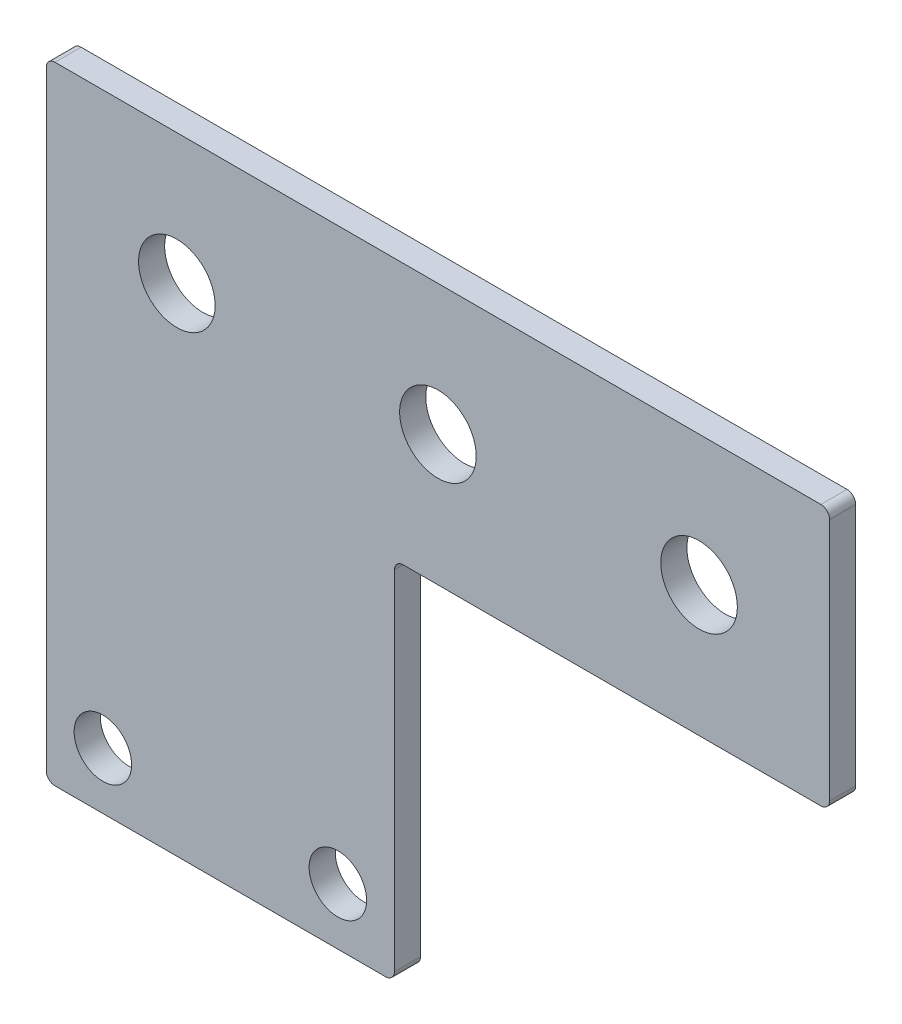
ISO-10303-21;
HEADER;
FILE_DESCRIPTION(('STEP AP214'),'2;1');
FILE_NAME('part.step','',(''),(''),'','','');
FILE_SCHEMA(('AUTOMOTIVE_DESIGN { 1 0 10303 214 1 1 1 1 }'));
ENDSEC;
DATA;
#1=APPLICATION_CONTEXT('core data for automotive mechanical design processes');
#2=APPLICATION_PROTOCOL_DEFINITION('international standard','automotive_design',2000,#1);
#3=PRODUCT_CONTEXT('',#1,'mechanical');
#4=PRODUCT('Part','Part','',(#3));
#5=PRODUCT_RELATED_PRODUCT_CATEGORY('part','',(#4));
#6=PRODUCT_DEFINITION_FORMATION('','',#4);
#7=PRODUCT_DEFINITION_CONTEXT('part definition',#1,'design');
#8=PRODUCT_DEFINITION('design','',#6,#7);
#9=PRODUCT_DEFINITION_SHAPE('','',#8);
#10=(LENGTH_UNIT() NAMED_UNIT(*) SI_UNIT(.MILLI.,.METRE.));
#11=(NAMED_UNIT(*) PLANE_ANGLE_UNIT() SI_UNIT($,.RADIAN.));
#12=(NAMED_UNIT(*) SI_UNIT($,.STERADIAN.) SOLID_ANGLE_UNIT());
#13=UNCERTAINTY_MEASURE_WITH_UNIT(LENGTH_MEASURE(1.E-05),#10,'distance_accuracy_value','');
#14=(GEOMETRIC_REPRESENTATION_CONTEXT(3) GLOBAL_UNCERTAINTY_ASSIGNED_CONTEXT((#13)) GLOBAL_UNIT_ASSIGNED_CONTEXT((#10,
#11,#12)) REPRESENTATION_CONTEXT('',''));
#15=CARTESIAN_POINT('',(0.,0.,0.));
#16=DIRECTION('',(0.,0.,1.));
#17=DIRECTION('',(1.,0.,0.));
#18=AXIS2_PLACEMENT_3D('',#15,#16,#17);
#19=CARTESIAN_POINT('',(0.,0.,3.));
#20=DIRECTION('',(0.,-1.,0.));
#21=DIRECTION('',(1.,0.,0.));
#22=AXIS2_PLACEMENT_3D('',#19,#20,#21);
#23=PLANE('',#22);
#24=DIRECTION('',(-1.,0.,0.));
#25=VECTOR('',#24,1.);
#26=CARTESIAN_POINT('',(0.,0.,0.));
#27=LINE('',#26,#25);
#28=CARTESIAN_POINT('',(89.,0.,0.));
#29=VERTEX_POINT('',#28);
#30=CARTESIAN_POINT('',(1.,0.,0.));
#31=VERTEX_POINT('',#30);
#32=EDGE_CURVE('E390',#29,#31,#27,.T.);
#33=ORIENTED_EDGE('',*,*,#32,.T.);
#34=DIRECTION('',(0.,0.,-1.));
#35=VECTOR('',#34,1.);
#36=CARTESIAN_POINT('',(1.,0.,3.));
#37=LINE('',#36,#35);
#38=CARTESIAN_POINT('',(1.,0.,3.));
#39=VERTEX_POINT('',#38);
#40=EDGE_CURVE('E247',#31,#39,#37,.F.);
#41=ORIENTED_EDGE('',*,*,#40,.T.);
#42=DIRECTION('',(-1.,0.,0.));
#43=VECTOR('',#42,1.);
#44=CARTESIAN_POINT('',(0.,0.,3.));
#45=LINE('',#44,#43);
#46=CARTESIAN_POINT('',(89.,0.,3.));
#47=VERTEX_POINT('',#46);
#48=EDGE_CURVE('E203',#47,#39,#45,.T.);
#49=ORIENTED_EDGE('',*,*,#48,.F.);
#50=DIRECTION('',(0.,0.,-1.));
#51=VECTOR('',#50,1.);
#52=CARTESIAN_POINT('',(89.,0.,3.));
#53=LINE('',#52,#51);
#54=EDGE_CURVE('E243',#47,#29,#53,.T.);
#55=ORIENTED_EDGE('',*,*,#54,.T.);
#56=EDGE_LOOP('',(#33,#41,#49,#55));
#57=FACE_BOUND('',#56,.T.);
#58=ADVANCED_FACE('F46',(#57),#23,.F.);
#59=CARTESIAN_POINT('',(0.,0.,3.));
#60=DIRECTION('',(1.,0.,0.));
#61=DIRECTION('',(0.,1.,0.));
#62=AXIS2_PLACEMENT_3D('',#59,#60,#61);
#63=PLANE('',#62);
#64=DIRECTION('',(0.,-1.,0.));
#65=VECTOR('',#64,1.);
#66=CARTESIAN_POINT('',(0.,0.,0.));
#67=LINE('',#66,#65);
#68=CARTESIAN_POINT('',(0.,-1.,0.));
#69=VERTEX_POINT('',#68);
#70=CARTESIAN_POINT('',(0.,-71.,0.));
#71=VERTEX_POINT('',#70);
#72=EDGE_CURVE('E177',#69,#71,#67,.T.);
#73=ORIENTED_EDGE('',*,*,#72,.T.);
#74=DIRECTION('',(0.,0.,-1.));
#75=VECTOR('',#74,1.);
#76=CARTESIAN_POINT('',(0.,-71.,3.));
#77=LINE('',#76,#75);
#78=CARTESIAN_POINT('',(0.,-71.,3.));
#79=VERTEX_POINT('',#78);
#80=EDGE_CURVE('E240',#71,#79,#77,.F.);
#81=ORIENTED_EDGE('',*,*,#80,.T.);
#82=DIRECTION('',(0.,-1.,0.));
#83=VECTOR('',#82,1.);
#84=CARTESIAN_POINT('',(0.,0.,3.));
#85=LINE('',#84,#83);
#86=CARTESIAN_POINT('',(0.,-1.,3.));
#87=VERTEX_POINT('',#86);
#88=EDGE_CURVE('E371',#87,#79,#85,.T.);
#89=ORIENTED_EDGE('',*,*,#88,.F.);
#90=DIRECTION('',(0.,0.,-1.));
#91=VECTOR('',#90,1.);
#92=CARTESIAN_POINT('',(0.,-1.,3.));
#93=LINE('',#92,#91);
#94=EDGE_CURVE('E236',#87,#69,#93,.T.);
#95=ORIENTED_EDGE('',*,*,#94,.T.);
#96=EDGE_LOOP('',(#73,#81,#89,#95));
#97=FACE_BOUND('',#96,.T.);
#98=ADVANCED_FACE('F411',(#97),#63,.F.);
#99=CARTESIAN_POINT('',(0.,-72.,3.));
#100=DIRECTION('',(0.,1.,0.));
#101=DIRECTION('',(-1.,0.,0.));
#102=AXIS2_PLACEMENT_3D('',#99,#100,#101);
#103=PLANE('',#102);
#104=DIRECTION('',(1.,0.,0.));
#105=VECTOR('',#104,1.);
#106=CARTESIAN_POINT('',(0.,-72.,0.));
#107=LINE('',#106,#105);
#108=CARTESIAN_POINT('',(1.00000000000001,-72.,0.));
#109=VERTEX_POINT('',#108);
#110=CARTESIAN_POINT('',(39.,-72.,0.));
#111=VERTEX_POINT('',#110);
#112=EDGE_CURVE('E168',#109,#111,#107,.T.);
#113=ORIENTED_EDGE('',*,*,#112,.T.);
#114=DIRECTION('',(0.,0.,-1.));
#115=VECTOR('',#114,1.);
#116=CARTESIAN_POINT('',(39.,-72.,3.));
#117=LINE('',#116,#115);
#118=CARTESIAN_POINT('',(39.,-72.,3.));
#119=VERTEX_POINT('',#118);
#120=EDGE_CURVE('E142',#111,#119,#117,.F.);
#121=ORIENTED_EDGE('',*,*,#120,.T.);
#122=DIRECTION('',(1.,0.,0.));
#123=VECTOR('',#122,1.);
#124=CARTESIAN_POINT('',(0.,-72.,3.));
#125=LINE('',#124,#123);
#126=CARTESIAN_POINT('',(1.00000000000001,-72.,3.));
#127=VERTEX_POINT('',#126);
#128=EDGE_CURVE('E366',#127,#119,#125,.T.);
#129=ORIENTED_EDGE('',*,*,#128,.F.);
#130=DIRECTION('',(0.,0.,-1.));
#131=VECTOR('',#130,1.);
#132=CARTESIAN_POINT('',(1.00000000000001,-72.,3.));
#133=LINE('',#132,#131);
#134=EDGE_CURVE('E148',#127,#109,#133,.T.);
#135=ORIENTED_EDGE('',*,*,#134,.T.);
#136=EDGE_LOOP('',(#113,#121,#129,#135));
#137=FACE_BOUND('',#136,.T.);
#138=ADVANCED_FACE('F419',(#137),#103,.F.);
#139=CARTESIAN_POINT('',(40.,0.,3.));
#140=DIRECTION('',(-1.,0.,0.));
#141=DIRECTION('',(0.,-1.,0.));
#142=AXIS2_PLACEMENT_3D('',#139,#140,#141);
#143=PLANE('',#142);
#144=DIRECTION('',(0.,1.,0.));
#145=VECTOR('',#144,1.);
#146=CARTESIAN_POINT('',(40.,0.,3.));
#147=LINE('',#146,#145);
#148=CARTESIAN_POINT('',(40.,-71.,3.));
#149=VERTEX_POINT('',#148);
#150=CARTESIAN_POINT('',(40.,-31.,3.));
#151=VERTEX_POINT('',#150);
#152=EDGE_CURVE('E158',#149,#151,#147,.T.);
#153=ORIENTED_EDGE('',*,*,#152,.F.);
#154=DIRECTION('',(0.,0.,-1.));
#155=VECTOR('',#154,1.);
#156=CARTESIAN_POINT('',(40.,-71.,3.));
#157=LINE('',#156,#155);
#158=CARTESIAN_POINT('',(40.,-71.,0.));
#159=VERTEX_POINT('',#158);
#160=EDGE_CURVE('E141',#149,#159,#157,.T.);
#161=ORIENTED_EDGE('',*,*,#160,.T.);
#162=DIRECTION('',(0.,1.,0.));
#163=VECTOR('',#162,1.);
#164=CARTESIAN_POINT('',(40.,0.,0.));
#165=LINE('',#164,#163);
#166=CARTESIAN_POINT('',(40.,-31.,0.));
#167=VERTEX_POINT('',#166);
#168=EDGE_CURVE('E155',#159,#167,#165,.T.);
#169=ORIENTED_EDGE('',*,*,#168,.T.);
#170=DIRECTION('',(0.,0.,-1.));
#171=VECTOR('',#170,1.);
#172=CARTESIAN_POINT('',(40.,-31.,3.));
#173=LINE('',#172,#171);
#174=EDGE_CURVE('E161',#167,#151,#173,.F.);
#175=ORIENTED_EDGE('',*,*,#174,.T.);
#176=EDGE_LOOP('',(#153,#161,#169,#175));
#177=FACE_BOUND('',#176,.T.);
#178=ADVANCED_FACE('F154',(#177),#143,.F.);
#179=CARTESIAN_POINT('',(0.,-30.,3.));
#180=DIRECTION('',(0.,1.,0.));
#181=DIRECTION('',(0.,0.,1.));
#182=AXIS2_PLACEMENT_3D('',#179,#180,#181);
#183=PLANE('',#182);
#184=DIRECTION('',(1.,0.,0.));
#185=VECTOR('',#184,1.);
#186=CARTESIAN_POINT('',(0.,-30.,0.));
#187=LINE('',#186,#185);
#188=CARTESIAN_POINT('',(41.,-30.,0.));
#189=VERTEX_POINT('',#188);
#190=CARTESIAN_POINT('',(89.,-30.,0.));
#191=VERTEX_POINT('',#190);
#192=EDGE_CURVE('E167',#189,#191,#187,.T.);
#193=ORIENTED_EDGE('',*,*,#192,.T.);
#194=DIRECTION('',(0.,0.,-1.));
#195=VECTOR('',#194,1.);
#196=CARTESIAN_POINT('',(89.,-30.,3.));
#197=LINE('',#196,#195);
#198=CARTESIAN_POINT('',(89.,-30.,3.));
#199=VERTEX_POINT('',#198);
#200=EDGE_CURVE('E260',#191,#199,#197,.F.);
#201=ORIENTED_EDGE('',*,*,#200,.T.);
#202=DIRECTION('',(1.,0.,0.));
#203=VECTOR('',#202,1.);
#204=CARTESIAN_POINT('',(0.,-30.,3.));
#205=LINE('',#204,#203);
#206=CARTESIAN_POINT('',(41.,-30.,3.));
#207=VERTEX_POINT('',#206);
#208=EDGE_CURVE('E357',#207,#199,#205,.T.);
#209=ORIENTED_EDGE('',*,*,#208,.F.);
#210=DIRECTION('',(0.,0.,-1.));
#211=VECTOR('',#210,1.);
#212=CARTESIAN_POINT('',(41.,-30.,0.));
#213=LINE('',#212,#211);
#214=EDGE_CURVE('E256',#207,#189,#213,.T.);
#215=ORIENTED_EDGE('',*,*,#214,.T.);
#216=EDGE_LOOP('',(#193,#201,#209,#215));
#217=FACE_BOUND('',#216,.T.);
#218=ADVANCED_FACE('F426',(#217),#183,.F.);
#219=CARTESIAN_POINT('',(15.,-15.,3.));
#220=DIRECTION('',(0.,0.,-1.));
#221=DIRECTION('',(-1.,0.,0.));
#222=AXIS2_PLACEMENT_3D('',#219,#220,#221);
#223=CYLINDRICAL_SURFACE('',#222,4.4);
#224=CARTESIAN_POINT('',(15.,-15.,3.));
#225=DIRECTION('',(0.,0.,1.));
#226=DIRECTION('',(1.,0.,0.));
#227=AXIS2_PLACEMENT_3D('',#224,#225,#226);
#228=CIRCLE('',#227,4.4);
#229=CARTESIAN_POINT('',(19.4,-15.,3.));
#230=VERTEX_POINT('',#229);
#231=EDGE_CURVE('E331',#230,#230,#228,.T.);
#232=ORIENTED_EDGE('',*,*,#231,.T.);
#233=EDGE_LOOP('',(#232));
#234=FACE_BOUND('',#233,.T.);
#235=CARTESIAN_POINT('',(15.,-15.,0.));
#236=DIRECTION('',(0.,0.,1.));
#237=DIRECTION('',(1.,0.,0.));
#238=AXIS2_PLACEMENT_3D('',#235,#236,#237);
#239=CIRCLE('',#238,4.4);
#240=CARTESIAN_POINT('',(19.4,-15.,0.));
#241=VERTEX_POINT('',#240);
#242=EDGE_CURVE('E195',#241,#241,#239,.T.);
#243=ORIENTED_EDGE('',*,*,#242,.F.);
#244=EDGE_LOOP('',(#243));
#245=FACE_BOUND('',#244,.T.);
#246=ADVANCED_FACE('F460',(#234,#245),#223,.F.);
#247=CARTESIAN_POINT('',(33.5,-65.5,3.));
#248=DIRECTION('',(0.,0.,-1.));
#249=DIRECTION('',(-1.,0.,0.));
#250=AXIS2_PLACEMENT_3D('',#247,#248,#249);
#251=CYLINDRICAL_SURFACE('',#250,3.3);
#252=CARTESIAN_POINT('',(33.5,-65.5,3.));
#253=DIRECTION('',(0.,0.,1.));
#254=DIRECTION('',(1.,0.,0.));
#255=AXIS2_PLACEMENT_3D('',#252,#253,#254);
#256=CIRCLE('',#255,3.3);
#257=CARTESIAN_POINT('',(36.8,-65.5,3.));
#258=VERTEX_POINT('',#257);
#259=EDGE_CURVE('E336',#258,#258,#256,.T.);
#260=ORIENTED_EDGE('',*,*,#259,.T.);
#261=EDGE_LOOP('',(#260));
#262=FACE_BOUND('',#261,.T.);
#263=CARTESIAN_POINT('',(33.5,-65.5,0.));
#264=DIRECTION('',(0.,0.,1.));
#265=DIRECTION('',(1.,0.,0.));
#266=AXIS2_PLACEMENT_3D('',#263,#264,#265);
#267=CIRCLE('',#266,3.3);
#268=CARTESIAN_POINT('',(36.8,-65.5,0.));
#269=VERTEX_POINT('',#268);
#270=EDGE_CURVE('E191',#269,#269,#267,.T.);
#271=ORIENTED_EDGE('',*,*,#270,.F.);
#272=EDGE_LOOP('',(#271));
#273=FACE_BOUND('',#272,.T.);
#274=ADVANCED_FACE('F465',(#262,#273),#251,.F.);
#275=CARTESIAN_POINT('',(45.,-15.,3.));
#276=DIRECTION('',(0.,0.,-1.));
#277=DIRECTION('',(-1.,0.,0.));
#278=AXIS2_PLACEMENT_3D('',#275,#276,#277);
#279=CYLINDRICAL_SURFACE('',#278,4.4);
#280=CARTESIAN_POINT('',(45.,-15.,3.));
#281=DIRECTION('',(0.,0.,1.));
#282=DIRECTION('',(1.,0.,0.));
#283=AXIS2_PLACEMENT_3D('',#280,#281,#282);
#284=CIRCLE('',#283,4.4);
#285=CARTESIAN_POINT('',(49.4,-15.,3.));
#286=VERTEX_POINT('',#285);
#287=EDGE_CURVE('E341',#286,#286,#284,.T.);
#288=ORIENTED_EDGE('',*,*,#287,.T.);
#289=EDGE_LOOP('',(#288));
#290=FACE_BOUND('',#289,.T.);
#291=CARTESIAN_POINT('',(45.,-15.,0.));
#292=DIRECTION('',(0.,0.,1.));
#293=DIRECTION('',(1.,0.,0.));
#294=AXIS2_PLACEMENT_3D('',#291,#292,#293);
#295=CIRCLE('',#294,4.4);
#296=CARTESIAN_POINT('',(49.4,-15.,0.));
#297=VERTEX_POINT('',#296);
#298=EDGE_CURVE('E187',#297,#297,#295,.T.);
#299=ORIENTED_EDGE('',*,*,#298,.F.);
#300=EDGE_LOOP('',(#299));
#301=FACE_BOUND('',#300,.T.);
#302=ADVANCED_FACE('F475',(#290,#301),#279,.F.);
#303=CARTESIAN_POINT('',(75.,-15.,3.));
#304=DIRECTION('',(0.,0.,-1.));
#305=DIRECTION('',(-1.,0.,0.));
#306=AXIS2_PLACEMENT_3D('',#303,#304,#305);
#307=CYLINDRICAL_SURFACE('',#306,4.4);
#308=CARTESIAN_POINT('',(75.,-15.,3.));
#309=DIRECTION('',(0.,0.,1.));
#310=DIRECTION('',(1.,0.,0.));
#311=AXIS2_PLACEMENT_3D('',#308,#309,#310);
#312=CIRCLE('',#311,4.4);
#313=CARTESIAN_POINT('',(79.4,-15.,3.));
#314=VERTEX_POINT('',#313);
#315=EDGE_CURVE('E346',#314,#314,#312,.T.);
#316=ORIENTED_EDGE('',*,*,#315,.T.);
#317=EDGE_LOOP('',(#316));
#318=FACE_BOUND('',#317,.T.);
#319=CARTESIAN_POINT('',(75.,-15.,0.));
#320=DIRECTION('',(0.,0.,1.));
#321=DIRECTION('',(1.,0.,0.));
#322=AXIS2_PLACEMENT_3D('',#319,#320,#321);
#323=CIRCLE('',#322,4.4);
#324=CARTESIAN_POINT('',(79.4,-15.,0.));
#325=VERTEX_POINT('',#324);
#326=EDGE_CURVE('E183',#325,#325,#323,.T.);
#327=ORIENTED_EDGE('',*,*,#326,.F.);
#328=EDGE_LOOP('',(#327));
#329=FACE_BOUND('',#328,.T.);
#330=ADVANCED_FACE('F472',(#318,#329),#307,.F.);
#331=CARTESIAN_POINT('',(90.,0.,3.));
#332=DIRECTION('',(-1.,0.,0.));
#333=DIRECTION('',(0.,0.,1.));
#334=AXIS2_PLACEMENT_3D('',#331,#332,#333);
#335=PLANE('',#334);
#336=DIRECTION('',(0.,1.,0.));
#337=VECTOR('',#336,1.);
#338=CARTESIAN_POINT('',(90.,0.,0.));
#339=LINE('',#338,#337);
#340=CARTESIAN_POINT('',(90.,-29.,0.));
#341=VERTEX_POINT('',#340);
#342=CARTESIAN_POINT('',(90.,-1.,0.));
#343=VERTEX_POINT('',#342);
#344=EDGE_CURVE('E175',#341,#343,#339,.T.);
#345=ORIENTED_EDGE('',*,*,#344,.T.);
#346=DIRECTION('',(0.,0.,-1.));
#347=VECTOR('',#346,1.);
#348=CARTESIAN_POINT('',(90.,-1.,3.));
#349=LINE('',#348,#347);
#350=CARTESIAN_POINT('',(90.,-1.,3.));
#351=VERTEX_POINT('',#350);
#352=EDGE_CURVE('E62',#343,#351,#349,.F.);
#353=ORIENTED_EDGE('',*,*,#352,.T.);
#354=DIRECTION('',(0.,1.,0.));
#355=VECTOR('',#354,1.);
#356=CARTESIAN_POINT('',(90.,0.,3.));
#357=LINE('',#356,#355);
#358=CARTESIAN_POINT('',(90.,-29.,3.));
#359=VERTEX_POINT('',#358);
#360=EDGE_CURVE('E352',#359,#351,#357,.T.);
#361=ORIENTED_EDGE('',*,*,#360,.F.);
#362=DIRECTION('',(0.,0.,-1.));
#363=VECTOR('',#362,1.);
#364=CARTESIAN_POINT('',(90.,-29.,3.));
#365=LINE('',#364,#363);
#366=EDGE_CURVE('E250',#359,#341,#365,.T.);
#367=ORIENTED_EDGE('',*,*,#366,.T.);
#368=EDGE_LOOP('',(#345,#353,#361,#367));
#369=FACE_BOUND('',#368,.T.);
#370=ADVANCED_FACE('F453',(#369),#335,.F.);
#371=CARTESIAN_POINT('',(6.50000000000001,-65.5,3.));
#372=DIRECTION('',(0.,0.,-1.));
#373=DIRECTION('',(-1.,0.,0.));
#374=AXIS2_PLACEMENT_3D('',#371,#372,#373);
#375=CYLINDRICAL_SURFACE('',#374,3.3);
#376=CARTESIAN_POINT('',(6.50000000000001,-65.5,3.));
#377=DIRECTION('',(0.,0.,1.));
#378=DIRECTION('',(1.,0.,0.));
#379=AXIS2_PLACEMENT_3D('',#376,#377,#378);
#380=CIRCLE('',#379,3.3);
#381=CARTESIAN_POINT('',(9.80000000000001,-65.5,3.));
#382=VERTEX_POINT('',#381);
#383=EDGE_CURVE('E205',#382,#382,#380,.F.);
#384=ORIENTED_EDGE('',*,*,#383,.F.);
#385=EDGE_LOOP('',(#384));
#386=FACE_BOUND('',#385,.T.);
#387=CARTESIAN_POINT('',(6.50000000000001,-65.5,0.));
#388=DIRECTION('',(0.,0.,1.));
#389=DIRECTION('',(1.,0.,0.));
#390=AXIS2_PLACEMENT_3D('',#387,#388,#389);
#391=CIRCLE('',#390,3.3);
#392=CARTESIAN_POINT('',(9.80000000000001,-65.5,0.));
#393=VERTEX_POINT('',#392);
#394=EDGE_CURVE('E199',#393,#393,#391,.F.);
#395=ORIENTED_EDGE('',*,*,#394,.T.);
#396=EDGE_LOOP('',(#395));
#397=FACE_BOUND('',#396,.T.);
#398=ADVANCED_FACE('F471',(#386,#397),#375,.F.);
#399=CARTESIAN_POINT('',(0.,0.,3.));
#400=DIRECTION('',(0.,0.,1.));
#401=DIRECTION('',(1.,0.,0.));
#402=AXIS2_PLACEMENT_3D('',#399,#400,#401);
#403=PLANE('',#402);
#404=ORIENTED_EDGE('',*,*,#128,.T.);
#405=CARTESIAN_POINT('',(39.,-71.,3.));
#406=DIRECTION('',(0.,0.,1.));
#407=DIRECTION('',(1.,0.,0.));
#408=AXIS2_PLACEMENT_3D('',#405,#406,#407);
#409=CIRCLE('',#408,1.);
#410=EDGE_CURVE('E233',#119,#149,#409,.T.);
#411=ORIENTED_EDGE('',*,*,#410,.T.);
#412=ORIENTED_EDGE('',*,*,#152,.T.);
#413=CARTESIAN_POINT('',(41.,-31.,3.));
#414=DIRECTION('',(0.,0.,1.));
#415=DIRECTION('',(1.,0.,0.));
#416=AXIS2_PLACEMENT_3D('',#413,#414,#415);
#417=CIRCLE('',#416,1.);
#418=EDGE_CURVE('E11',#151,#207,#417,.F.);
#419=ORIENTED_EDGE('',*,*,#418,.T.);
#420=ORIENTED_EDGE('',*,*,#208,.T.);
#421=CARTESIAN_POINT('',(89.,-29.,3.));
#422=DIRECTION('',(0.,0.,1.));
#423=DIRECTION('',(1.,0.,0.));
#424=AXIS2_PLACEMENT_3D('',#421,#422,#423);
#425=CIRCLE('',#424,1.);
#426=EDGE_CURVE('E69',#199,#359,#425,.T.);
#427=ORIENTED_EDGE('',*,*,#426,.T.);
#428=ORIENTED_EDGE('',*,*,#360,.T.);
#429=CARTESIAN_POINT('',(89.,-1.,3.));
#430=DIRECTION('',(0.,0.,1.));
#431=DIRECTION('',(1.,0.,0.));
#432=AXIS2_PLACEMENT_3D('',#429,#430,#431);
#433=CIRCLE('',#432,1.);
#434=EDGE_CURVE('E224',#351,#47,#433,.T.);
#435=ORIENTED_EDGE('',*,*,#434,.T.);
#436=ORIENTED_EDGE('',*,*,#48,.T.);
#437=CARTESIAN_POINT('',(1.,-1.,3.));
#438=DIRECTION('',(0.,0.,1.));
#439=DIRECTION('',(1.,0.,0.));
#440=AXIS2_PLACEMENT_3D('',#437,#438,#439);
#441=CIRCLE('',#440,1.);
#442=EDGE_CURVE('E227',#39,#87,#441,.T.);
#443=ORIENTED_EDGE('',*,*,#442,.T.);
#444=ORIENTED_EDGE('',*,*,#88,.T.);
#445=CARTESIAN_POINT('',(1.00000000000001,-71.,3.));
#446=DIRECTION('',(0.,0.,1.));
#447=DIRECTION('',(1.,0.,0.));
#448=AXIS2_PLACEMENT_3D('',#445,#446,#447);
#449=CIRCLE('',#448,1.);
#450=EDGE_CURVE('E230',#79,#127,#449,.T.);
#451=ORIENTED_EDGE('',*,*,#450,.T.);
#452=EDGE_LOOP('',(#404,#411,#412,#419,#420,#427,#428,#435,#436,#443,#444,#451));
#453=FACE_BOUND('',#452,.T.);
#454=ORIENTED_EDGE('',*,*,#315,.F.);
#455=EDGE_LOOP('',(#454));
#456=FACE_BOUND('',#455,.T.);
#457=ORIENTED_EDGE('',*,*,#287,.F.);
#458=EDGE_LOOP('',(#457));
#459=FACE_BOUND('',#458,.T.);
#460=ORIENTED_EDGE('',*,*,#259,.F.);
#461=EDGE_LOOP('',(#460));
#462=FACE_BOUND('',#461,.T.);
#463=ORIENTED_EDGE('',*,*,#231,.F.);
#464=EDGE_LOOP('',(#463));
#465=FACE_BOUND('',#464,.T.);
#466=ORIENTED_EDGE('',*,*,#383,.T.);
#467=EDGE_LOOP('',(#466));
#468=FACE_BOUND('',#467,.T.);
#469=ADVANCED_FACE('F407',(#453,#456,#459,#462,#465,#468),#403,.T.);
#470=CARTESIAN_POINT('',(0.,0.,0.));
#471=DIRECTION('',(0.,0.,1.));
#472=DIRECTION('',(1.,0.,0.));
#473=AXIS2_PLACEMENT_3D('',#470,#471,#472);
#474=PLANE('',#473);
#475=ORIENTED_EDGE('',*,*,#168,.F.);
#476=CARTESIAN_POINT('',(39.,-71.,0.));
#477=DIRECTION('',(0.,0.,1.));
#478=DIRECTION('',(1.,0.,0.));
#479=AXIS2_PLACEMENT_3D('',#476,#477,#478);
#480=CIRCLE('',#479,1.);
#481=EDGE_CURVE('E137',#159,#111,#480,.F.);
#482=ORIENTED_EDGE('',*,*,#481,.T.);
#483=ORIENTED_EDGE('',*,*,#112,.F.);
#484=CARTESIAN_POINT('',(1.00000000000001,-71.,0.));
#485=DIRECTION('',(0.,0.,1.));
#486=DIRECTION('',(1.,0.,0.));
#487=AXIS2_PLACEMENT_3D('',#484,#485,#486);
#488=CIRCLE('',#487,1.);
#489=EDGE_CURVE('E149',#109,#71,#488,.F.);
#490=ORIENTED_EDGE('',*,*,#489,.T.);
#491=ORIENTED_EDGE('',*,*,#72,.F.);
#492=CARTESIAN_POINT('',(1.,-1.,0.));
#493=DIRECTION('',(0.,0.,1.));
#494=DIRECTION('',(1.,0.,0.));
#495=AXIS2_PLACEMENT_3D('',#492,#493,#494);
#496=CIRCLE('',#495,1.);
#497=EDGE_CURVE('E212',#69,#31,#496,.F.);
#498=ORIENTED_EDGE('',*,*,#497,.T.);
#499=ORIENTED_EDGE('',*,*,#32,.F.);
#500=CARTESIAN_POINT('',(89.,-1.,0.));
#501=DIRECTION('',(0.,0.,1.));
#502=DIRECTION('',(1.,0.,0.));
#503=AXIS2_PLACEMENT_3D('',#500,#501,#502);
#504=CIRCLE('',#503,1.);
#505=EDGE_CURVE('E209',#29,#343,#504,.F.);
#506=ORIENTED_EDGE('',*,*,#505,.T.);
#507=ORIENTED_EDGE('',*,*,#344,.F.);
#508=CARTESIAN_POINT('',(89.,-29.,0.));
#509=DIRECTION('',(0.,0.,1.));
#510=DIRECTION('',(1.,0.,0.));
#511=AXIS2_PLACEMENT_3D('',#508,#509,#510);
#512=CIRCLE('',#511,1.);
#513=EDGE_CURVE('E160',#341,#191,#512,.F.);
#514=ORIENTED_EDGE('',*,*,#513,.T.);
#515=ORIENTED_EDGE('',*,*,#192,.F.);
#516=CARTESIAN_POINT('',(41.,-31.,0.));
#517=DIRECTION('',(0.,0.,1.));
#518=DIRECTION('',(1.,0.,0.));
#519=AXIS2_PLACEMENT_3D('',#516,#517,#518);
#520=CIRCLE('',#519,1.);
#521=EDGE_CURVE('E55',#189,#167,#520,.T.);
#522=ORIENTED_EDGE('',*,*,#521,.T.);
#523=EDGE_LOOP('',(#475,#482,#483,#490,#491,#498,#499,#506,#507,#514,#515,#522));
#524=FACE_BOUND('',#523,.T.);
#525=ORIENTED_EDGE('',*,*,#326,.T.);
#526=EDGE_LOOP('',(#525));
#527=FACE_BOUND('',#526,.T.);
#528=ORIENTED_EDGE('',*,*,#298,.T.);
#529=EDGE_LOOP('',(#528));
#530=FACE_BOUND('',#529,.T.);
#531=ORIENTED_EDGE('',*,*,#270,.T.);
#532=EDGE_LOOP('',(#531));
#533=FACE_BOUND('',#532,.T.);
#534=ORIENTED_EDGE('',*,*,#242,.T.);
#535=EDGE_LOOP('',(#534));
#536=FACE_BOUND('',#535,.T.);
#537=ORIENTED_EDGE('',*,*,#394,.F.);
#538=EDGE_LOOP('',(#537));
#539=FACE_BOUND('',#538,.T.);
#540=ADVANCED_FACE('F163',(#524,#527,#530,#533,#536,#539),#474,.F.);
#541=CARTESIAN_POINT('',(39.,-71.,3.));
#542=DIRECTION('',(0.,0.,-1.));
#543=DIRECTION('',(-1.,0.,0.));
#544=AXIS2_PLACEMENT_3D('',#541,#542,#543);
#545=CYLINDRICAL_SURFACE('',#544,1.);
#546=ORIENTED_EDGE('',*,*,#410,.F.);
#547=ORIENTED_EDGE('',*,*,#120,.F.);
#548=ORIENTED_EDGE('',*,*,#481,.F.);
#549=ORIENTED_EDGE('',*,*,#160,.F.);
#550=EDGE_LOOP('',(#546,#547,#548,#549));
#551=FACE_BOUND('',#550,.T.);
#552=ADVANCED_FACE('F140',(#551),#545,.T.);
#553=CARTESIAN_POINT('',(1.00000000000001,-71.,3.));
#554=DIRECTION('',(0.,0.,-1.));
#555=DIRECTION('',(-1.,0.,0.));
#556=AXIS2_PLACEMENT_3D('',#553,#554,#555);
#557=CYLINDRICAL_SURFACE('',#556,1.);
#558=ORIENTED_EDGE('',*,*,#450,.F.);
#559=ORIENTED_EDGE('',*,*,#80,.F.);
#560=ORIENTED_EDGE('',*,*,#489,.F.);
#561=ORIENTED_EDGE('',*,*,#134,.F.);
#562=EDGE_LOOP('',(#558,#559,#560,#561));
#563=FACE_BOUND('',#562,.T.);
#564=ADVANCED_FACE('F415',(#563),#557,.T.);
#565=CARTESIAN_POINT('',(1.,-1.,3.));
#566=DIRECTION('',(0.,0.,-1.));
#567=DIRECTION('',(-1.,0.,0.));
#568=AXIS2_PLACEMENT_3D('',#565,#566,#567);
#569=CYLINDRICAL_SURFACE('',#568,1.);
#570=ORIENTED_EDGE('',*,*,#442,.F.);
#571=ORIENTED_EDGE('',*,*,#40,.F.);
#572=ORIENTED_EDGE('',*,*,#497,.F.);
#573=ORIENTED_EDGE('',*,*,#94,.F.);
#574=EDGE_LOOP('',(#570,#571,#572,#573));
#575=FACE_BOUND('',#574,.T.);
#576=ADVANCED_FACE('F404',(#575),#569,.T.);
#577=CARTESIAN_POINT('',(89.,-1.,3.));
#578=DIRECTION('',(0.,0.,-1.));
#579=DIRECTION('',(-1.,0.,0.));
#580=AXIS2_PLACEMENT_3D('',#577,#578,#579);
#581=CYLINDRICAL_SURFACE('',#580,1.);
#582=ORIENTED_EDGE('',*,*,#434,.F.);
#583=ORIENTED_EDGE('',*,*,#352,.F.);
#584=ORIENTED_EDGE('',*,*,#505,.F.);
#585=ORIENTED_EDGE('',*,*,#54,.F.);
#586=EDGE_LOOP('',(#582,#583,#584,#585));
#587=FACE_BOUND('',#586,.T.);
#588=ADVANCED_FACE('F440',(#587),#581,.T.);
#589=CARTESIAN_POINT('',(89.,-29.,3.));
#590=DIRECTION('',(0.,0.,-1.));
#591=DIRECTION('',(-1.,0.,0.));
#592=AXIS2_PLACEMENT_3D('',#589,#590,#591);
#593=CYLINDRICAL_SURFACE('',#592,1.);
#594=ORIENTED_EDGE('',*,*,#426,.F.);
#595=ORIENTED_EDGE('',*,*,#200,.F.);
#596=ORIENTED_EDGE('',*,*,#513,.F.);
#597=ORIENTED_EDGE('',*,*,#366,.F.);
#598=EDGE_LOOP('',(#594,#595,#596,#597));
#599=FACE_BOUND('',#598,.T.);
#600=ADVANCED_FACE('F442',(#599),#593,.T.);
#601=CARTESIAN_POINT('',(41.,-31.,3.));
#602=DIRECTION('',(0.,0.,1.));
#603=DIRECTION('',(1.,0.,0.));
#604=AXIS2_PLACEMENT_3D('',#601,#602,#603);
#605=CYLINDRICAL_SURFACE('',#604,1.);
#606=ORIENTED_EDGE('',*,*,#418,.F.);
#607=ORIENTED_EDGE('',*,*,#174,.F.);
#608=ORIENTED_EDGE('',*,*,#521,.F.);
#609=ORIENTED_EDGE('',*,*,#214,.F.);
#610=EDGE_LOOP('',(#606,#607,#608,#609));
#611=FACE_BOUND('',#610,.T.);
#612=ADVANCED_FACE('F48',(#611),#605,.F.);
#613=CLOSED_SHELL('',(#58,#98,#138,#178,#218,#246,#274,#302,#330,#370,#398,#469,#540,#552,#564,
#576,#588,#600,#612));
#614=MANIFOLD_SOLID_BREP('B2',#613);
#615=ADVANCED_BREP_SHAPE_REPRESENTATION('',(#18,#614),#14);
#616=SHAPE_DEFINITION_REPRESENTATION(#9,#615);
ENDSEC;
END-ISO-10303-21;
